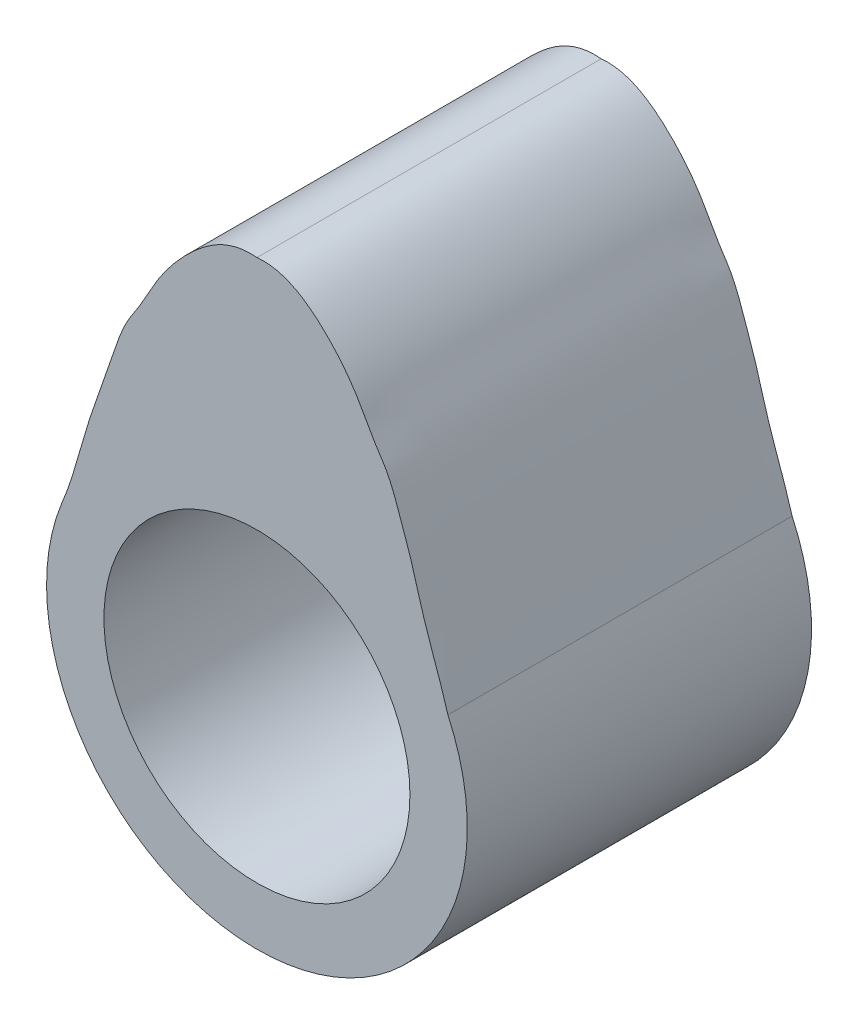
ISO-10303-21;
HEADER;
FILE_DESCRIPTION(('STEP AP214'),'2;1');
FILE_NAME('part.step','',(''),(''),'','','');
FILE_SCHEMA(('AUTOMOTIVE_DESIGN { 1 0 10303 214 1 1 1 1 }'));
ENDSEC;
DATA;
#1=APPLICATION_CONTEXT('core data for automotive mechanical design processes');
#2=APPLICATION_PROTOCOL_DEFINITION('international standard','automotive_design',2000,#1);
#3=PRODUCT_CONTEXT('',#1,'mechanical');
#4=PRODUCT('Part','Part','',(#3));
#5=PRODUCT_RELATED_PRODUCT_CATEGORY('part','',(#4));
#6=PRODUCT_DEFINITION_FORMATION('','',#4);
#7=PRODUCT_DEFINITION_CONTEXT('part definition',#1,'design');
#8=PRODUCT_DEFINITION('design','',#6,#7);
#9=PRODUCT_DEFINITION_SHAPE('','',#8);
#10=(LENGTH_UNIT() NAMED_UNIT(*) SI_UNIT(.MILLI.,.METRE.));
#11=(NAMED_UNIT(*) PLANE_ANGLE_UNIT() SI_UNIT($,.RADIAN.));
#12=(NAMED_UNIT(*) SI_UNIT($,.STERADIAN.) SOLID_ANGLE_UNIT());
#13=UNCERTAINTY_MEASURE_WITH_UNIT(LENGTH_MEASURE(1.E-05),#10,'distance_accuracy_value','');
#14=(GEOMETRIC_REPRESENTATION_CONTEXT(3) GLOBAL_UNCERTAINTY_ASSIGNED_CONTEXT((#13)) GLOBAL_UNIT_ASSIGNED_CONTEXT((#10,
#11,#12)) REPRESENTATION_CONTEXT('',''));
#15=CARTESIAN_POINT('',(0.,0.,0.));
#16=DIRECTION('',(0.,0.,1.));
#17=DIRECTION('',(1.,0.,0.));
#18=AXIS2_PLACEMENT_3D('',#15,#16,#17);
#19=CARTESIAN_POINT('',(0.,20.3285526029191,18.));
#20=CARTESIAN_POINT('',(1.38287488072056,20.4716788414837,18.));
#21=CARTESIAN_POINT('',(3.38743768515901,19.1409577408532,18.));
#22=CARTESIAN_POINT('',(5.14920396929792,16.9373618236711,18.));
#23=CARTESIAN_POINT('',(6.01984348793838,15.1895917810668,18.));
#24=CARTESIAN_POINT('',(6.94726478000152,13.9011221516591,18.));
#25=CARTESIAN_POINT('',(7.48194051298877,12.3010286656875,18.));
#26=CARTESIAN_POINT('',(8.12364570199452,10.5483881638994,18.));
#27=CARTESIAN_POINT('',(8.79227790021169,7.9286924274786,18.));
#28=CARTESIAN_POINT('',(9.58809838743118,5.99820489010945,18.));
#29=CARTESIAN_POINT('',(9.9866590385104,4.61157687223562,18.));
#30=B_SPLINE_CURVE_WITH_KNOTS('',3,(#19,#20,#21,#22,#23,#24,#25,#26,#27,#28,#29),.UNSPECIFIED.,
.F.,.F.,(4,1,1,1,1,1,1,1,4),(0.,0.197957328777186,0.347933102662575,0.427687733530884,
0.494984691769653,0.588497982865572,0.682566948134596,0.780100181930215,1.),.UNSPECIFIED.);
#31=DIRECTION('',(0.,0.,-1.));
#32=VECTOR('',#31,1.);
#33=SURFACE_OF_LINEAR_EXTRUSION('',#30,#32);
#34=CARTESIAN_POINT('',(0.,20.3285526029191,0.));
#35=CARTESIAN_POINT('',(1.38287488072056,20.4716788414837,0.));
#36=CARTESIAN_POINT('',(3.38743768515901,19.1409577408532,0.));
#37=CARTESIAN_POINT('',(5.14920396929792,16.9373618236711,0.));
#38=CARTESIAN_POINT('',(6.01984348793838,15.1895917810668,0.));
#39=CARTESIAN_POINT('',(6.94726478000152,13.9011221516591,0.));
#40=CARTESIAN_POINT('',(7.48194051298877,12.3010286656875,0.));
#41=CARTESIAN_POINT('',(8.12364570199452,10.5483881638994,0.));
#42=CARTESIAN_POINT('',(8.79227790021169,7.9286924274786,0.));
#43=CARTESIAN_POINT('',(9.58809838743118,5.99820489010945,0.));
#44=CARTESIAN_POINT('',(9.9866590385104,4.61157687223562,0.));
#45=B_SPLINE_CURVE_WITH_KNOTS('',3,(#34,#35,#36,#37,#38,#39,#40,#41,#42,#43,#44),.UNSPECIFIED.,
.F.,.F.,(4,1,1,1,1,1,1,1,4),(0.,0.197957328777186,0.347933102662575,0.427687733530884,
0.494984691769653,0.588497982865572,0.682566948134596,0.780100181930215,1.),.UNSPECIFIED.);
#46=CARTESIAN_POINT('',(0.,20.3285526029191,0.));
#47=VERTEX_POINT('',#46);
#48=CARTESIAN_POINT('',(9.9866590385104,4.61157687223562,0.));
#49=VERTEX_POINT('',#48);
#50=EDGE_CURVE('E75',#47,#49,#45,.T.);
#51=ORIENTED_EDGE('',*,*,#50,.F.);
#52=DIRECTION('',(0.,0.,-1.));
#53=VECTOR('',#52,1.);
#54=CARTESIAN_POINT('',(0.,20.3285526029191,18.));
#55=LINE('',#54,#53);
#56=CARTESIAN_POINT('',(0.,20.3285526029191,18.));
#57=VERTEX_POINT('',#56);
#58=EDGE_CURVE('E11',#57,#47,#55,.T.);
#59=ORIENTED_EDGE('',*,*,#58,.F.);
#60=CARTESIAN_POINT('',(9.9866590385104,4.61157687223562,18.));
#61=VERTEX_POINT('',#60);
#62=EDGE_CURVE('E73',#57,#61,#30,.T.);
#63=ORIENTED_EDGE('',*,*,#62,.T.);
#64=DIRECTION('',(0.,0.,-1.));
#65=VECTOR('',#64,1.);
#66=CARTESIAN_POINT('',(9.9866590385104,4.61157687223562,18.));
#67=LINE('',#66,#65);
#68=EDGE_CURVE('E69',#61,#49,#67,.T.);
#69=ORIENTED_EDGE('',*,*,#68,.T.);
#70=EDGE_LOOP('',(#51,#59,#63,#69));
#71=FACE_BOUND('',#70,.T.);
#72=ADVANCED_FACE('F34',(#71),#33,.T.);
#73=CARTESIAN_POINT('',(0.,20.3285526029191,18.));
#74=CARTESIAN_POINT('',(-1.38282536593601,20.4716630963222,18.));
#75=CARTESIAN_POINT('',(-3.38759387689024,19.1410074081202,18.));
#76=CARTESIAN_POINT('',(-5.14891218507131,16.9372690394694,18.));
#77=CARTESIAN_POINT('',(-6.02034890766053,15.1897524990261,18.));
#78=CARTESIAN_POINT('',(-6.94541902999641,13.9005352232882,18.));
#79=CARTESIAN_POINT('',(-7.49198916920463,12.3042240287679,18.));
#80=CARTESIAN_POINT('',(-8.08915515468966,10.5260368108664,18.));
#81=CARTESIAN_POINT('',(-9.08906664926617,7.80818967652757,18.));
#82=CARTESIAN_POINT('',(-9.57400312950673,5.57610667326905,18.));
#83=CARTESIAN_POINT('',(-10.2172585531403,4.07524571753419,18.));
#84=B_SPLINE_CURVE_WITH_KNOTS('',3,(#73,#74,#75,#76,#77,#78,#79,#80,#81,#82,#83),.UNSPECIFIED.,
.F.,.F.,(4,1,1,1,1,1,1,1,4),(0.,0.19227478909825,0.33794537614743,0.415410580009991,
0.48077571972087,0.571604629336988,0.662973262009084,0.759317857482183,1.),.UNSPECIFIED.);
#85=DIRECTION('',(0.,0.,-1.));
#86=VECTOR('',#85,1.);
#87=SURFACE_OF_LINEAR_EXTRUSION('',#84,#86);
#88=CARTESIAN_POINT('',(0.,20.3285526029191,0.));
#89=CARTESIAN_POINT('',(-1.38282536593601,20.4716630963222,0.));
#90=CARTESIAN_POINT('',(-3.38759387689024,19.1410074081202,0.));
#91=CARTESIAN_POINT('',(-5.14891218507131,16.9372690394694,0.));
#92=CARTESIAN_POINT('',(-6.02034890766053,15.1897524990261,0.));
#93=CARTESIAN_POINT('',(-6.94541902999641,13.9005352232882,0.));
#94=CARTESIAN_POINT('',(-7.49198916920463,12.3042240287679,0.));
#95=CARTESIAN_POINT('',(-8.08915515468966,10.5260368108664,0.));
#96=CARTESIAN_POINT('',(-9.08906664926617,7.80818967652757,0.));
#97=CARTESIAN_POINT('',(-9.57400312950673,5.57610667326905,0.));
#98=CARTESIAN_POINT('',(-10.2172585531403,4.07524571753419,0.));
#99=B_SPLINE_CURVE_WITH_KNOTS('',3,(#88,#89,#90,#91,#92,#93,#94,#95,#96,#97,#98),.UNSPECIFIED.,
.F.,.F.,(4,1,1,1,1,1,1,1,4),(0.,0.19227478909825,0.33794537614743,0.415410580009991,
0.48077571972087,0.571604629336988,0.662973262009084,0.759317857482183,1.),.UNSPECIFIED.);
#100=CARTESIAN_POINT('',(-10.2172585531403,4.07524571753419,0.));
#101=VERTEX_POINT('',#100);
#102=EDGE_CURVE('E63',#47,#101,#99,.T.);
#103=ORIENTED_EDGE('',*,*,#102,.T.);
#104=DIRECTION('',(0.,0.,-1.));
#105=VECTOR('',#104,1.);
#106=CARTESIAN_POINT('',(-10.2172585531403,4.07524571753419,18.));
#107=LINE('',#106,#105);
#108=CARTESIAN_POINT('',(-10.2172585531403,4.07524571753419,18.));
#109=VERTEX_POINT('',#108);
#110=EDGE_CURVE('E43',#109,#101,#107,.T.);
#111=ORIENTED_EDGE('',*,*,#110,.F.);
#112=EDGE_CURVE('E76',#57,#109,#84,.T.);
#113=ORIENTED_EDGE('',*,*,#112,.F.);
#114=ORIENTED_EDGE('',*,*,#58,.T.);
#115=EDGE_LOOP('',(#103,#111,#113,#114));
#116=FACE_BOUND('',#115,.T.);
#117=ADVANCED_FACE('F77',(#116),#87,.F.);
#118=CARTESIAN_POINT('',(0.,0.,18.));
#119=DIRECTION('',(0.,0.,-1.));
#120=DIRECTION('',(-1.,0.,0.));
#121=AXIS2_PLACEMENT_3D('',#118,#119,#120);
#122=CYLINDRICAL_SURFACE('',#121,11.);
#123=CARTESIAN_POINT('',(0.,0.,0.));
#124=DIRECTION('',(0.,0.,1.));
#125=DIRECTION('',(1.,0.,0.));
#126=AXIS2_PLACEMENT_3D('',#123,#124,#125);
#127=CIRCLE('',#126,11.);
#128=EDGE_CURVE('E83',#101,#49,#127,.T.);
#129=ORIENTED_EDGE('',*,*,#128,.T.);
#130=ORIENTED_EDGE('',*,*,#68,.F.);
#131=CARTESIAN_POINT('',(0.,0.,18.));
#132=DIRECTION('',(0.,0.,1.));
#133=DIRECTION('',(1.,0.,0.));
#134=AXIS2_PLACEMENT_3D('',#131,#132,#133);
#135=CIRCLE('',#134,11.);
#136=EDGE_CURVE('E51',#109,#61,#135,.T.);
#137=ORIENTED_EDGE('',*,*,#136,.F.);
#138=ORIENTED_EDGE('',*,*,#110,.T.);
#139=EDGE_LOOP('',(#129,#130,#137,#138));
#140=FACE_BOUND('',#139,.T.);
#141=ADVANCED_FACE('F101',(#140),#122,.T.);
#142=CARTESIAN_POINT('',(0.,0.,18.));
#143=DIRECTION('',(0.,0.,-1.));
#144=DIRECTION('',(-1.,0.,0.));
#145=AXIS2_PLACEMENT_3D('',#142,#143,#144);
#146=CYLINDRICAL_SURFACE('',#145,8.);
#147=CARTESIAN_POINT('',(0.,0.,18.));
#148=DIRECTION('',(0.,0.,1.));
#149=DIRECTION('',(1.,0.,0.));
#150=AXIS2_PLACEMENT_3D('',#147,#148,#149);
#151=CIRCLE('',#150,8.);
#152=CARTESIAN_POINT('',(8.,0.,18.));
#153=VERTEX_POINT('',#152);
#154=EDGE_CURVE('E165',#153,#153,#151,.T.);
#155=ORIENTED_EDGE('',*,*,#154,.T.);
#156=EDGE_LOOP('',(#155));
#157=FACE_BOUND('',#156,.T.);
#158=CARTESIAN_POINT('',(0.,0.,0.));
#159=DIRECTION('',(0.,0.,1.));
#160=DIRECTION('',(1.,0.,0.));
#161=AXIS2_PLACEMENT_3D('',#158,#159,#160);
#162=CIRCLE('',#161,8.);
#163=CARTESIAN_POINT('',(8.,0.,0.));
#164=VERTEX_POINT('',#163);
#165=EDGE_CURVE('E81',#164,#164,#162,.T.);
#166=ORIENTED_EDGE('',*,*,#165,.F.);
#167=EDGE_LOOP('',(#166));
#168=FACE_BOUND('',#167,.T.);
#169=ADVANCED_FACE('F104',(#157,#168),#146,.F.);
#170=CARTESIAN_POINT('',(0.,0.,18.));
#171=DIRECTION('',(0.,0.,1.));
#172=DIRECTION('',(1.,0.,0.));
#173=AXIS2_PLACEMENT_3D('',#170,#171,#172);
#174=PLANE('',#173);
#175=ORIENTED_EDGE('',*,*,#62,.F.);
#176=ORIENTED_EDGE('',*,*,#112,.T.);
#177=ORIENTED_EDGE('',*,*,#136,.T.);
#178=EDGE_LOOP('',(#175,#176,#177));
#179=FACE_BOUND('',#178,.T.);
#180=ORIENTED_EDGE('',*,*,#154,.F.);
#181=EDGE_LOOP('',(#180));
#182=FACE_BOUND('',#181,.T.);
#183=ADVANCED_FACE('F79',(#179,#182),#174,.T.);
#184=CARTESIAN_POINT('',(0.,0.,0.));
#185=DIRECTION('',(0.,0.,1.));
#186=DIRECTION('',(1.,0.,0.));
#187=AXIS2_PLACEMENT_3D('',#184,#185,#186);
#188=PLANE('',#187);
#189=ORIENTED_EDGE('',*,*,#50,.T.);
#190=ORIENTED_EDGE('',*,*,#128,.F.);
#191=ORIENTED_EDGE('',*,*,#102,.F.);
#192=EDGE_LOOP('',(#189,#190,#191));
#193=FACE_BOUND('',#192,.T.);
#194=ORIENTED_EDGE('',*,*,#165,.T.);
#195=EDGE_LOOP('',(#194));
#196=FACE_BOUND('',#195,.T.);
#197=ADVANCED_FACE('F109',(#193,#196),#188,.F.);
#198=CLOSED_SHELL('',(#72,#117,#141,#169,#183,#197));
#199=MANIFOLD_SOLID_BREP('B2',#198);
#200=ADVANCED_BREP_SHAPE_REPRESENTATION('',(#18,#199),#14);
#201=SHAPE_DEFINITION_REPRESENTATION(#9,#200);
ENDSEC;
END-ISO-10303-21;
